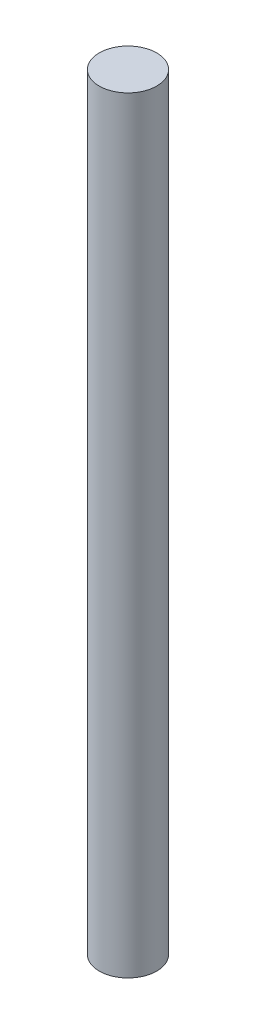
ISO-10303-21;
HEADER;
FILE_DESCRIPTION(('STEP AP214'),'2;1');
FILE_NAME('part.step','',(''),(''),'','','');
FILE_SCHEMA(('AUTOMOTIVE_DESIGN { 1 0 10303 214 1 1 1 1 }'));
ENDSEC;
DATA;
#1=APPLICATION_CONTEXT('core data for automotive mechanical design processes');
#2=APPLICATION_PROTOCOL_DEFINITION('international standard','automotive_design',2000,#1);
#3=PRODUCT_CONTEXT('',#1,'mechanical');
#4=PRODUCT('Part','Part','',(#3));
#5=PRODUCT_RELATED_PRODUCT_CATEGORY('part','',(#4));
#6=PRODUCT_DEFINITION_FORMATION('','',#4);
#7=PRODUCT_DEFINITION_CONTEXT('part definition',#1,'design');
#8=PRODUCT_DEFINITION('design','',#6,#7);
#9=PRODUCT_DEFINITION_SHAPE('','',#8);
#10=(LENGTH_UNIT() NAMED_UNIT(*) SI_UNIT(.MILLI.,.METRE.));
#11=(NAMED_UNIT(*) PLANE_ANGLE_UNIT() SI_UNIT($,.RADIAN.));
#12=(NAMED_UNIT(*) SI_UNIT($,.STERADIAN.) SOLID_ANGLE_UNIT());
#13=UNCERTAINTY_MEASURE_WITH_UNIT(LENGTH_MEASURE(1.E-05),#10,'distance_accuracy_value','');
#14=(GEOMETRIC_REPRESENTATION_CONTEXT(3) GLOBAL_UNCERTAINTY_ASSIGNED_CONTEXT((#13)) GLOBAL_UNIT_ASSIGNED_CONTEXT((#10,
#11,#12)) REPRESENTATION_CONTEXT('',''));
#15=CARTESIAN_POINT('',(0.,0.,0.));
#16=DIRECTION('',(0.,0.,1.));
#17=DIRECTION('',(1.,0.,0.));
#18=AXIS2_PLACEMENT_3D('',#15,#16,#17);
#19=CARTESIAN_POINT('',(0.,40.,-1.43993359432682));
#20=DIRECTION('',(0.,-1.,0.));
#21=DIRECTION('',(0.,0.,-1.));
#22=AXIS2_PLACEMENT_3D('',#19,#20,#21);
#23=CYLINDRICAL_SURFACE('',#22,1.5);
#24=CARTESIAN_POINT('',(0.,40.,-1.43993359432682));
#25=DIRECTION('',(0.,1.,0.));
#26=DIRECTION('',(0.,0.,1.));
#27=AXIS2_PLACEMENT_3D('',#24,#25,#26);
#28=CIRCLE('',#27,1.5);
#29=CARTESIAN_POINT('',(0.,40.,0.060066405673177));
#30=VERTEX_POINT('',#29);
#31=EDGE_CURVE('E10',#30,#30,#28,.T.);
#32=ORIENTED_EDGE('',*,*,#31,.F.);
#33=EDGE_LOOP('',(#32));
#34=FACE_BOUND('',#33,.T.);
#35=CARTESIAN_POINT('',(0.,0.,-1.43993359432682));
#36=DIRECTION('',(0.,1.,0.));
#37=DIRECTION('',(0.,0.,1.));
#38=AXIS2_PLACEMENT_3D('',#35,#36,#37);
#39=CIRCLE('',#38,1.5);
#40=CARTESIAN_POINT('',(0.,0.,0.060066405673177));
#41=VERTEX_POINT('',#40);
#42=EDGE_CURVE('E38',#41,#41,#39,.T.);
#43=ORIENTED_EDGE('',*,*,#42,.T.);
#44=EDGE_LOOP('',(#43));
#45=FACE_BOUND('',#44,.T.);
#46=ADVANCED_FACE('F35',(#34,#45),#23,.T.);
#47=CARTESIAN_POINT('',(0.,40.,-1.43993359432682));
#48=DIRECTION('',(0.,1.,0.));
#49=DIRECTION('',(0.,0.,1.));
#50=AXIS2_PLACEMENT_3D('',#47,#48,#49);
#51=PLANE('',#50);
#52=ORIENTED_EDGE('',*,*,#31,.T.);
#53=EDGE_LOOP('',(#52));
#54=FACE_BOUND('',#53,.T.);
#55=ADVANCED_FACE('F50',(#54),#51,.T.);
#56=CARTESIAN_POINT('',(0.,0.,-1.43993359432682));
#57=DIRECTION('',(0.,1.,0.));
#58=DIRECTION('',(0.,0.,1.));
#59=AXIS2_PLACEMENT_3D('',#56,#57,#58);
#60=PLANE('',#59);
#61=ORIENTED_EDGE('',*,*,#42,.F.);
#62=EDGE_LOOP('',(#61));
#63=FACE_BOUND('',#62,.T.);
#64=ADVANCED_FACE('F48',(#63),#60,.F.);
#65=CLOSED_SHELL('',(#46,#55,#64));
#66=MANIFOLD_SOLID_BREP('B2',#65);
#67=ADVANCED_BREP_SHAPE_REPRESENTATION('',(#18,#66),#14);
#68=SHAPE_DEFINITION_REPRESENTATION(#9,#67);
ENDSEC;
END-ISO-10303-21;
